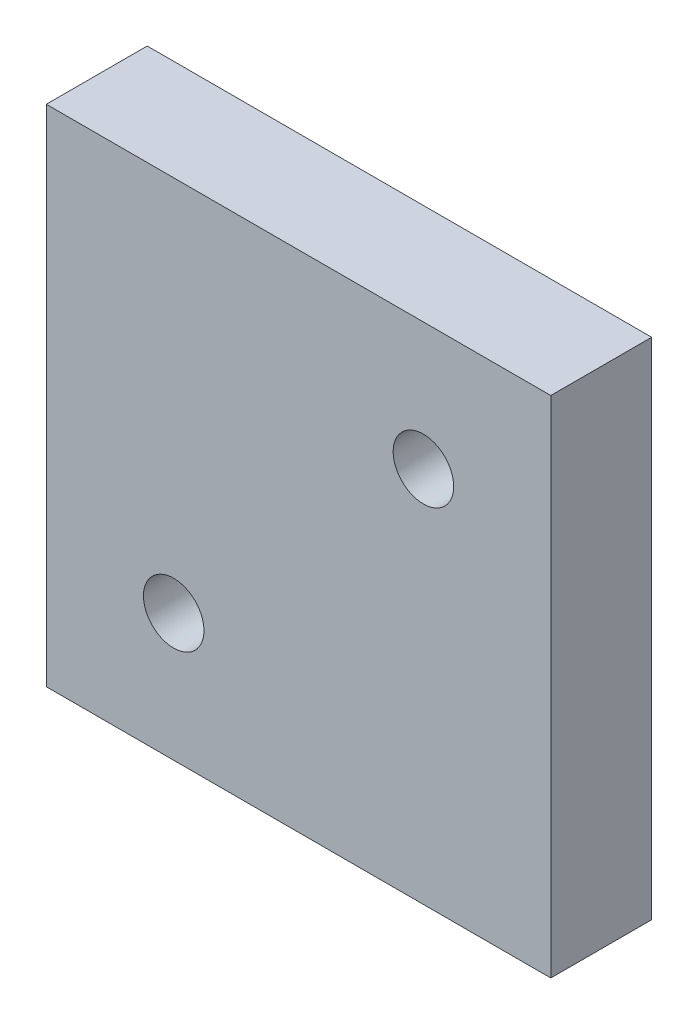
ISO-10303-21;
HEADER;
FILE_DESCRIPTION(('STEP AP214'),'2;1');
FILE_NAME('part.step','',(''),(''),'','','');
FILE_SCHEMA(('AUTOMOTIVE_DESIGN { 1 0 10303 214 1 1 1 1 }'));
ENDSEC;
DATA;
#1=APPLICATION_CONTEXT('core data for automotive mechanical design processes');
#2=APPLICATION_PROTOCOL_DEFINITION('international standard','automotive_design',2000,#1);
#3=PRODUCT_CONTEXT('',#1,'mechanical');
#4=PRODUCT('Part','Part','',(#3));
#5=PRODUCT_RELATED_PRODUCT_CATEGORY('part','',(#4));
#6=PRODUCT_DEFINITION_FORMATION('','',#4);
#7=PRODUCT_DEFINITION_CONTEXT('part definition',#1,'design');
#8=PRODUCT_DEFINITION('design','',#6,#7);
#9=PRODUCT_DEFINITION_SHAPE('','',#8);
#10=(LENGTH_UNIT() NAMED_UNIT(*) SI_UNIT(.MILLI.,.METRE.));
#11=(NAMED_UNIT(*) PLANE_ANGLE_UNIT() SI_UNIT($,.RADIAN.));
#12=(NAMED_UNIT(*) SI_UNIT($,.STERADIAN.) SOLID_ANGLE_UNIT());
#13=UNCERTAINTY_MEASURE_WITH_UNIT(LENGTH_MEASURE(1.E-05),#10,'distance_accuracy_value','');
#14=(GEOMETRIC_REPRESENTATION_CONTEXT(3) GLOBAL_UNCERTAINTY_ASSIGNED_CONTEXT((#13)) GLOBAL_UNIT_ASSIGNED_CONTEXT((#10,
#11,#12)) REPRESENTATION_CONTEXT('',''));
#15=CARTESIAN_POINT('',(0.,0.,0.));
#16=DIRECTION('',(0.,0.,1.));
#17=DIRECTION('',(1.,0.,0.));
#18=AXIS2_PLACEMENT_3D('',#15,#16,#17);
#19=CARTESIAN_POINT('',(50.,0.,20.));
#20=DIRECTION('',(1.,0.,0.));
#21=DIRECTION('',(0.,1.,0.));
#22=AXIS2_PLACEMENT_3D('',#19,#20,#21);
#23=PLANE('',#22);
#24=DIRECTION('',(0.,-1.,0.));
#25=VECTOR('',#24,1.);
#26=CARTESIAN_POINT('',(50.,0.,0.));
#27=LINE('',#26,#25);
#28=CARTESIAN_POINT('',(50.,50.,0.));
#29=VERTEX_POINT('',#28);
#30=CARTESIAN_POINT('',(50.,-50.,0.));
#31=VERTEX_POINT('',#30);
#32=EDGE_CURVE('E102',#29,#31,#27,.T.);
#33=ORIENTED_EDGE('',*,*,#32,.F.);
#34=DIRECTION('',(0.,0.,-1.));
#35=VECTOR('',#34,1.);
#36=CARTESIAN_POINT('',(50.,50.,20.));
#37=LINE('',#36,#35);
#38=CARTESIAN_POINT('',(50.,50.,20.));
#39=VERTEX_POINT('',#38);
#40=EDGE_CURVE('E11',#39,#29,#37,.T.);
#41=ORIENTED_EDGE('',*,*,#40,.F.);
#42=DIRECTION('',(0.,-1.,0.));
#43=VECTOR('',#42,1.);
#44=CARTESIAN_POINT('',(50.,0.,20.));
#45=LINE('',#44,#43);
#46=CARTESIAN_POINT('',(50.,-50.,20.));
#47=VERTEX_POINT('',#46);
#48=EDGE_CURVE('E95',#39,#47,#45,.T.);
#49=ORIENTED_EDGE('',*,*,#48,.T.);
#50=DIRECTION('',(0.,0.,-1.));
#51=VECTOR('',#50,1.);
#52=CARTESIAN_POINT('',(50.,-50.,20.));
#53=LINE('',#52,#51);
#54=EDGE_CURVE('E76',#47,#31,#53,.T.);
#55=ORIENTED_EDGE('',*,*,#54,.T.);
#56=EDGE_LOOP('',(#33,#41,#49,#55));
#57=FACE_BOUND('',#56,.T.);
#58=ADVANCED_FACE('F38',(#57),#23,.T.);
#59=CARTESIAN_POINT('',(0.,50.,20.));
#60=DIRECTION('',(0.,1.,0.));
#61=DIRECTION('',(0.,0.,1.));
#62=AXIS2_PLACEMENT_3D('',#59,#60,#61);
#63=PLANE('',#62);
#64=DIRECTION('',(1.,0.,0.));
#65=VECTOR('',#64,1.);
#66=CARTESIAN_POINT('',(0.,50.,0.));
#67=LINE('',#66,#65);
#68=CARTESIAN_POINT('',(-50.,50.,0.));
#69=VERTEX_POINT('',#68);
#70=EDGE_CURVE('E89',#69,#29,#67,.T.);
#71=ORIENTED_EDGE('',*,*,#70,.F.);
#72=DIRECTION('',(0.,0.,-1.));
#73=VECTOR('',#72,1.);
#74=CARTESIAN_POINT('',(-50.,50.,20.));
#75=LINE('',#74,#73);
#76=CARTESIAN_POINT('',(-50.,50.,20.));
#77=VERTEX_POINT('',#76);
#78=EDGE_CURVE('E46',#77,#69,#75,.T.);
#79=ORIENTED_EDGE('',*,*,#78,.F.);
#80=DIRECTION('',(1.,0.,0.));
#81=VECTOR('',#80,1.);
#82=CARTESIAN_POINT('',(0.,50.,20.));
#83=LINE('',#82,#81);
#84=EDGE_CURVE('E87',#77,#39,#83,.T.);
#85=ORIENTED_EDGE('',*,*,#84,.T.);
#86=ORIENTED_EDGE('',*,*,#40,.T.);
#87=EDGE_LOOP('',(#71,#79,#85,#86));
#88=FACE_BOUND('',#87,.T.);
#89=ADVANCED_FACE('F85',(#88),#63,.T.);
#90=CARTESIAN_POINT('',(-50.,0.,20.));
#91=DIRECTION('',(1.,0.,0.));
#92=DIRECTION('',(0.,1.,0.));
#93=AXIS2_PLACEMENT_3D('',#90,#91,#92);
#94=PLANE('',#93);
#95=DIRECTION('',(0.,-1.,0.));
#96=VECTOR('',#95,1.);
#97=CARTESIAN_POINT('',(-50.,0.,0.));
#98=LINE('',#97,#96);
#99=CARTESIAN_POINT('',(-50.,-50.,0.));
#100=VERTEX_POINT('',#99);
#101=EDGE_CURVE('E69',#69,#100,#98,.T.);
#102=ORIENTED_EDGE('',*,*,#101,.T.);
#103=DIRECTION('',(0.,0.,-1.));
#104=VECTOR('',#103,1.);
#105=CARTESIAN_POINT('',(-50.,-50.,20.));
#106=LINE('',#105,#104);
#107=CARTESIAN_POINT('',(-50.,-50.,20.));
#108=VERTEX_POINT('',#107);
#109=EDGE_CURVE('E90',#108,#100,#106,.T.);
#110=ORIENTED_EDGE('',*,*,#109,.F.);
#111=DIRECTION('',(0.,-1.,0.));
#112=VECTOR('',#111,1.);
#113=CARTESIAN_POINT('',(-50.,0.,20.));
#114=LINE('',#113,#112);
#115=EDGE_CURVE('E91',#77,#108,#114,.T.);
#116=ORIENTED_EDGE('',*,*,#115,.F.);
#117=ORIENTED_EDGE('',*,*,#78,.T.);
#118=EDGE_LOOP('',(#102,#110,#116,#117));
#119=FACE_BOUND('',#118,.T.);
#120=ADVANCED_FACE('F92',(#119),#94,.F.);
#121=CARTESIAN_POINT('',(0.,-50.,20.));
#122=DIRECTION('',(0.,1.,0.));
#123=DIRECTION('',(0.,0.,1.));
#124=AXIS2_PLACEMENT_3D('',#121,#122,#123);
#125=PLANE('',#124);
#126=DIRECTION('',(1.,0.,0.));
#127=VECTOR('',#126,1.);
#128=CARTESIAN_POINT('',(0.,-50.,0.));
#129=LINE('',#128,#127);
#130=EDGE_CURVE('E97',#100,#31,#129,.T.);
#131=ORIENTED_EDGE('',*,*,#130,.T.);
#132=ORIENTED_EDGE('',*,*,#54,.F.);
#133=DIRECTION('',(1.,0.,0.));
#134=VECTOR('',#133,1.);
#135=CARTESIAN_POINT('',(0.,-50.,20.));
#136=LINE('',#135,#134);
#137=EDGE_CURVE('E54',#108,#47,#136,.T.);
#138=ORIENTED_EDGE('',*,*,#137,.F.);
#139=ORIENTED_EDGE('',*,*,#109,.T.);
#140=EDGE_LOOP('',(#131,#132,#138,#139));
#141=FACE_BOUND('',#140,.T.);
#142=ADVANCED_FACE('F112',(#141),#125,.F.);
#143=CARTESIAN_POINT('',(0.,0.,20.));
#144=DIRECTION('',(0.,0.,1.));
#145=DIRECTION('',(1.,0.,0.));
#146=AXIS2_PLACEMENT_3D('',#143,#144,#145);
#147=PLANE('',#146);
#148=CARTESIAN_POINT('',(24.7487373415292,24.7487373415292,20.));
#149=DIRECTION('',(0.,0.,-1.));
#150=DIRECTION('',(-1.,0.,0.));
#151=AXIS2_PLACEMENT_3D('',#148,#149,#150);
#152=CIRCLE('',#151,5.99999999999999);
#153=CARTESIAN_POINT('',(18.7487373415292,24.7487373415292,20.));
#154=VERTEX_POINT('',#153);
#155=EDGE_CURVE('E144',#154,#154,#152,.T.);
#156=ORIENTED_EDGE('',*,*,#155,.T.);
#157=EDGE_LOOP('',(#156));
#158=FACE_BOUND('',#157,.T.);
#159=CARTESIAN_POINT('',(-24.7487373415292,-24.7487373415292,20.));
#160=DIRECTION('',(0.,0.,-1.));
#161=DIRECTION('',(-1.,0.,0.));
#162=AXIS2_PLACEMENT_3D('',#159,#160,#161);
#163=CIRCLE('',#162,5.99999999999999);
#164=CARTESIAN_POINT('',(-30.7487373415291,-24.7487373415292,20.));
#165=VERTEX_POINT('',#164);
#166=EDGE_CURVE('E105',#165,#165,#163,.T.);
#167=ORIENTED_EDGE('',*,*,#166,.T.);
#168=EDGE_LOOP('',(#167));
#169=FACE_BOUND('',#168,.T.);
#170=ORIENTED_EDGE('',*,*,#48,.F.);
#171=ORIENTED_EDGE('',*,*,#84,.F.);
#172=ORIENTED_EDGE('',*,*,#115,.T.);
#173=ORIENTED_EDGE('',*,*,#137,.T.);
#174=EDGE_LOOP('',(#170,#171,#172,#173));
#175=FACE_BOUND('',#174,.T.);
#176=ADVANCED_FACE('F94',(#158,#169,#175),#147,.T.);
#177=CARTESIAN_POINT('',(0.,0.,0.));
#178=DIRECTION('',(0.,0.,1.));
#179=DIRECTION('',(1.,0.,0.));
#180=AXIS2_PLACEMENT_3D('',#177,#178,#179);
#181=PLANE('',#180);
#182=CARTESIAN_POINT('',(24.7487373415292,24.7487373415292,0.));
#183=DIRECTION('',(0.,0.,-1.));
#184=DIRECTION('',(-1.,0.,0.));
#185=AXIS2_PLACEMENT_3D('',#182,#183,#184);
#186=CIRCLE('',#185,6.);
#187=CARTESIAN_POINT('',(18.7487373415292,24.7487373415292,0.));
#188=VERTEX_POINT('',#187);
#189=EDGE_CURVE('E147',#188,#188,#186,.T.);
#190=ORIENTED_EDGE('',*,*,#189,.F.);
#191=EDGE_LOOP('',(#190));
#192=FACE_BOUND('',#191,.T.);
#193=CARTESIAN_POINT('',(-24.7487373415292,-24.7487373415292,0.));
#194=DIRECTION('',(0.,0.,-1.));
#195=DIRECTION('',(-1.,0.,0.));
#196=AXIS2_PLACEMENT_3D('',#193,#194,#195);
#197=CIRCLE('',#196,6.);
#198=CARTESIAN_POINT('',(-30.7487373415291,-24.7487373415292,0.));
#199=VERTEX_POINT('',#198);
#200=EDGE_CURVE('E149',#199,#199,#197,.T.);
#201=ORIENTED_EDGE('',*,*,#200,.F.);
#202=EDGE_LOOP('',(#201));
#203=FACE_BOUND('',#202,.T.);
#204=ORIENTED_EDGE('',*,*,#32,.T.);
#205=ORIENTED_EDGE('',*,*,#130,.F.);
#206=ORIENTED_EDGE('',*,*,#101,.F.);
#207=ORIENTED_EDGE('',*,*,#70,.T.);
#208=EDGE_LOOP('',(#204,#205,#206,#207));
#209=FACE_BOUND('',#208,.T.);
#210=ADVANCED_FACE('F114',(#192,#203,#209),#181,.F.);
#211=CARTESIAN_POINT('',(-24.7487373415292,-24.7487373415292,0.));
#212=DIRECTION('',(0.,0.,-1.));
#213=DIRECTION('',(-1.,0.,0.));
#214=AXIS2_PLACEMENT_3D('',#211,#212,#213);
#215=CYLINDRICAL_SURFACE('',#214,6.);
#216=ORIENTED_EDGE('',*,*,#166,.F.);
#217=EDGE_LOOP('',(#216));
#218=FACE_BOUND('',#217,.T.);
#219=ORIENTED_EDGE('',*,*,#200,.T.);
#220=EDGE_LOOP('',(#219));
#221=FACE_BOUND('',#220,.T.);
#222=ADVANCED_FACE('F128',(#218,#221),#215,.F.);
#223=CARTESIAN_POINT('',(24.7487373415292,24.7487373415292,0.));
#224=DIRECTION('',(0.,0.,-1.));
#225=DIRECTION('',(-1.,0.,0.));
#226=AXIS2_PLACEMENT_3D('',#223,#224,#225);
#227=CYLINDRICAL_SURFACE('',#226,6.);
#228=ORIENTED_EDGE('',*,*,#155,.F.);
#229=EDGE_LOOP('',(#228));
#230=FACE_BOUND('',#229,.T.);
#231=ORIENTED_EDGE('',*,*,#189,.T.);
#232=EDGE_LOOP('',(#231));
#233=FACE_BOUND('',#232,.T.);
#234=ADVANCED_FACE('F135',(#230,#233),#227,.F.);
#235=CLOSED_SHELL('',(#58,#89,#120,#142,#176,#210,#222,#234));
#236=MANIFOLD_SOLID_BREP('B2',#235);
#237=ADVANCED_BREP_SHAPE_REPRESENTATION('',(#18,#236),#14);
#238=SHAPE_DEFINITION_REPRESENTATION(#9,#237);
ENDSEC;
END-ISO-10303-21;
